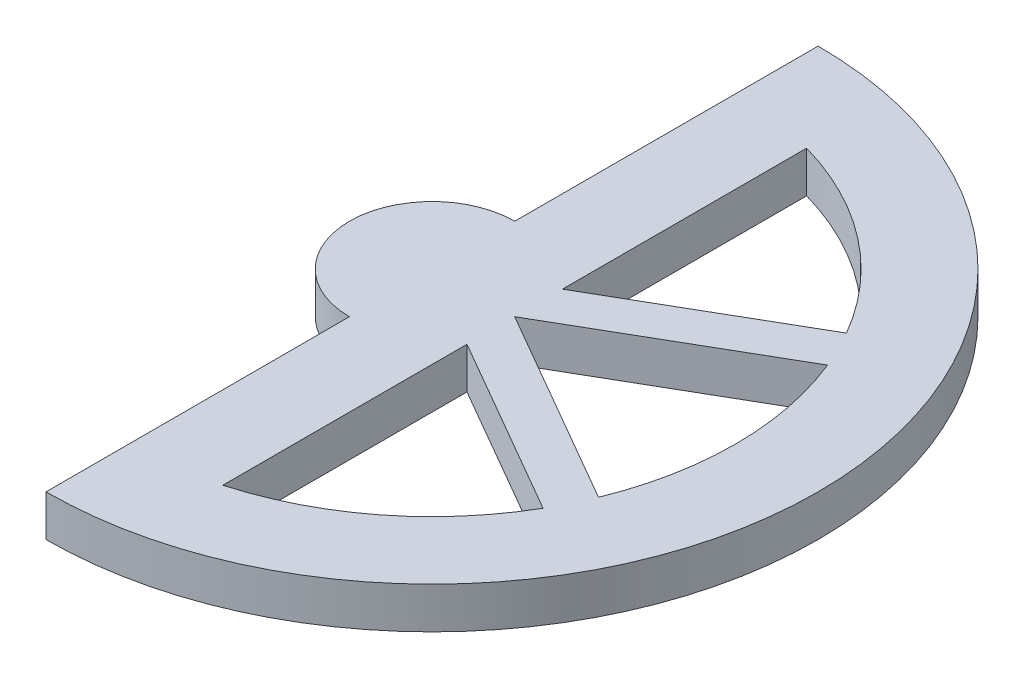
ISO-10303-21;
HEADER;
FILE_DESCRIPTION(('STEP AP214'),'2;1');
FILE_NAME('part.step','',(''),(''),'','','');
FILE_SCHEMA(('AUTOMOTIVE_DESIGN { 1 0 10303 214 1 1 1 1 }'));
ENDSEC;
DATA;
#1=APPLICATION_CONTEXT('core data for automotive mechanical design processes');
#2=APPLICATION_PROTOCOL_DEFINITION('international standard','automotive_design',2000,#1);
#3=PRODUCT_CONTEXT('',#1,'mechanical');
#4=PRODUCT('Part','Part','',(#3));
#5=PRODUCT_RELATED_PRODUCT_CATEGORY('part','',(#4));
#6=PRODUCT_DEFINITION_FORMATION('','',#4);
#7=PRODUCT_DEFINITION_CONTEXT('part definition',#1,'design');
#8=PRODUCT_DEFINITION('design','',#6,#7);
#9=PRODUCT_DEFINITION_SHAPE('','',#8);
#10=(LENGTH_UNIT() NAMED_UNIT(*) SI_UNIT(.MILLI.,.METRE.));
#11=(NAMED_UNIT(*) PLANE_ANGLE_UNIT() SI_UNIT($,.RADIAN.));
#12=(NAMED_UNIT(*) SI_UNIT($,.STERADIAN.) SOLID_ANGLE_UNIT());
#13=UNCERTAINTY_MEASURE_WITH_UNIT(LENGTH_MEASURE(1.E-05),#10,'distance_accuracy_value','');
#14=(GEOMETRIC_REPRESENTATION_CONTEXT(3) GLOBAL_UNCERTAINTY_ASSIGNED_CONTEXT((#13)) GLOBAL_UNIT_ASSIGNED_CONTEXT((#10,
#11,#12)) REPRESENTATION_CONTEXT('',''));
#15=CARTESIAN_POINT('',(0.,0.,0.));
#16=DIRECTION('',(0.,0.,1.));
#17=DIRECTION('',(1.,0.,0.));
#18=AXIS2_PLACEMENT_3D('',#15,#16,#17);
#19=CARTESIAN_POINT('',(0.,3.175,0.));
#20=DIRECTION('',(0.,1.,0.));
#21=DIRECTION('',(0.,0.,1.));
#22=AXIS2_PLACEMENT_3D('',#19,#20,#21);
#23=PLANE('',#22);
#24=CARTESIAN_POINT('',(0.,3.175,0.));
#25=DIRECTION('',(0.,1.,0.));
#26=DIRECTION('',(0.,0.,1.));
#27=AXIS2_PLACEMENT_3D('',#24,#25,#26);
#28=CIRCLE('',#27,29.6545);
#29=CARTESIAN_POINT('',(0.,3.175,29.6545));
#30=VERTEX_POINT('',#29);
#31=CARTESIAN_POINT('',(0.,3.175,-29.6545));
#32=VERTEX_POINT('',#31);
#33=EDGE_CURVE('E203',#30,#32,#28,.T.);
#34=ORIENTED_EDGE('',*,*,#33,.T.);
#35=DIRECTION('',(0.,0.,1.));
#36=VECTOR('',#35,1.);
#37=CARTESIAN_POINT('',(0.,3.175,-29.6545));
#38=LINE('',#37,#36);
#39=CARTESIAN_POINT('',(0.,3.175,-6.35));
#40=VERTEX_POINT('',#39);
#41=EDGE_CURVE('E206',#32,#40,#38,.T.);
#42=ORIENTED_EDGE('',*,*,#41,.T.);
#43=CARTESIAN_POINT('',(0.,3.175,0.));
#44=DIRECTION('',(0.,1.,0.));
#45=DIRECTION('',(0.,0.,1.));
#46=AXIS2_PLACEMENT_3D('',#43,#44,#45);
#47=CIRCLE('',#46,6.35);
#48=CARTESIAN_POINT('',(0.,3.175,6.35));
#49=VERTEX_POINT('',#48);
#50=EDGE_CURVE('E209',#40,#49,#47,.T.);
#51=ORIENTED_EDGE('',*,*,#50,.T.);
#52=DIRECTION('',(0.,0.,1.));
#53=VECTOR('',#52,1.);
#54=CARTESIAN_POINT('',(0.,3.175,6.35));
#55=LINE('',#54,#53);
#56=EDGE_CURVE('E211',#49,#30,#55,.T.);
#57=ORIENTED_EDGE('',*,*,#56,.T.);
#58=EDGE_LOOP('',(#34,#42,#51,#57));
#59=FACE_BOUND('',#58,.T.);
#60=CARTESIAN_POINT('',(0.,3.175,0.));
#61=DIRECTION('',(0.,1.,0.));
#62=DIRECTION('',(0.,0.,1.));
#63=AXIS2_PLACEMENT_3D('',#60,#61,#62);
#64=CIRCLE('',#63,23.3045);
#65=CARTESIAN_POINT('',(6.35000000000001,3.175,22.4226943129054));
#66=VERTEX_POINT('',#65);
#67=CARTESIAN_POINT('',(20.1822890224945,3.175,11.65225));
#68=VERTEX_POINT('',#67);
#69=EDGE_CURVE('E181',#66,#68,#64,.T.);
#70=ORIENTED_EDGE('',*,*,#69,.F.);
#71=DIRECTION('',(0.,0.,1.));
#72=VECTOR('',#71,1.);
#73=CARTESIAN_POINT('',(6.35000000000001,3.175,3.66617420935412));
#74=LINE('',#73,#72);
#75=CARTESIAN_POINT('',(6.35000000000001,3.175,3.66617420935412));
#76=VERTEX_POINT('',#75);
#77=EDGE_CURVE('E179',#76,#66,#74,.T.);
#78=ORIENTED_EDGE('',*,*,#77,.F.);
#79=DIRECTION('',(-0.86602540378444,0.,-0.499999999999998));
#80=VECTOR('',#79,1.);
#81=CARTESIAN_POINT('',(6.35000000000001,3.175,3.66617420935412));
#82=LINE('',#81,#80);
#83=EDGE_CURVE('E185',#68,#76,#82,.T.);
#84=ORIENTED_EDGE('',*,*,#83,.F.);
#85=EDGE_LOOP('',(#70,#78,#84));
#86=FACE_BOUND('',#85,.T.);
#87=DIRECTION('',(0.,0.,1.));
#88=VECTOR('',#87,1.);
#89=CARTESIAN_POINT('',(6.35000000000001,3.175,-22.4226943129054));
#90=LINE('',#89,#88);
#91=CARTESIAN_POINT('',(6.35000000000001,3.175,-22.4226943129054));
#92=VERTEX_POINT('',#91);
#93=CARTESIAN_POINT('',(6.35,3.175,-3.6661742093542));
#94=VERTEX_POINT('',#93);
#95=EDGE_CURVE('E157',#92,#94,#90,.T.);
#96=ORIENTED_EDGE('',*,*,#95,.F.);
#97=CARTESIAN_POINT('',(0.,3.175,0.));
#98=DIRECTION('',(0.,1.,0.));
#99=DIRECTION('',(0.,0.,1.));
#100=AXIS2_PLACEMENT_3D('',#97,#98,#99);
#101=CIRCLE('',#100,23.3045);
#102=CARTESIAN_POINT('',(20.1822890224944,3.175,-11.6522500000001));
#103=VERTEX_POINT('',#102);
#104=EDGE_CURVE('E155',#103,#92,#101,.T.);
#105=ORIENTED_EDGE('',*,*,#104,.F.);
#106=DIRECTION('',(0.866025403784436,0.,-0.500000000000005));
#107=VECTOR('',#106,1.);
#108=CARTESIAN_POINT('',(6.35,3.175,-3.6661742093542));
#109=LINE('',#108,#107);
#110=EDGE_CURVE('E161',#94,#103,#109,.T.);
#111=ORIENTED_EDGE('',*,*,#110,.F.);
#112=EDGE_LOOP('',(#96,#105,#111));
#113=FACE_BOUND('',#112,.T.);
#114=DIRECTION('',(0.86602540378444,0.,0.499999999999998));
#115=VECTOR('',#114,1.);
#116=CARTESIAN_POINT('',(6.34999999999995,3.175,0.));
#117=LINE('',#116,#115);
#118=CARTESIAN_POINT('',(6.34999999999995,3.175,0.));
#119=VERTEX_POINT('',#118);
#120=CARTESIAN_POINT('',(21.5816071678007,3.175,8.79397249852033));
#121=VERTEX_POINT('',#120);
#122=EDGE_CURVE('E136',#119,#121,#117,.T.);
#123=ORIENTED_EDGE('',*,*,#122,.F.);
#124=DIRECTION('',(-0.866025403784436,0.,0.500000000000005));
#125=VECTOR('',#124,1.);
#126=CARTESIAN_POINT('',(6.34999999999995,3.175,0.));
#127=LINE('',#126,#125);
#128=CARTESIAN_POINT('',(21.5816071678007,3.175,-8.79397249852051));
#129=VERTEX_POINT('',#128);
#130=EDGE_CURVE('E128',#129,#119,#127,.T.);
#131=ORIENTED_EDGE('',*,*,#130,.F.);
#132=CARTESIAN_POINT('',(0.,3.175,0.));
#133=DIRECTION('',(0.,1.,0.));
#134=DIRECTION('',(0.,0.,1.));
#135=AXIS2_PLACEMENT_3D('',#132,#133,#134);
#136=CIRCLE('',#135,23.3045);
#137=EDGE_CURVE('E145',#121,#129,#136,.T.);
#138=ORIENTED_EDGE('',*,*,#137,.F.);
#139=EDGE_LOOP('',(#123,#131,#138));
#140=FACE_BOUND('',#139,.T.);
#141=ADVANCED_FACE('F33',(#59,#86,#113,#140),#23,.T.);
#142=CARTESIAN_POINT('',(0.,0.,0.));
#143=DIRECTION('',(0.,1.,0.));
#144=DIRECTION('',(0.,0.,1.));
#145=AXIS2_PLACEMENT_3D('',#142,#143,#144);
#146=PLANE('',#145);
#147=CARTESIAN_POINT('',(0.,0.,0.));
#148=DIRECTION('',(0.,1.,0.));
#149=DIRECTION('',(0.,0.,1.));
#150=AXIS2_PLACEMENT_3D('',#147,#148,#149);
#151=CIRCLE('',#150,23.3045);
#152=CARTESIAN_POINT('',(20.1822890224944,0.,-11.6522500000001));
#153=VERTEX_POINT('',#152);
#154=CARTESIAN_POINT('',(6.35000000000001,0.,-22.4226943129054));
#155=VERTEX_POINT('',#154);
#156=EDGE_CURVE('E143',#153,#155,#151,.T.);
#157=ORIENTED_EDGE('',*,*,#156,.T.);
#158=DIRECTION('',(0.,0.,1.));
#159=VECTOR('',#158,1.);
#160=CARTESIAN_POINT('',(6.35000000000001,0.,-22.4226943129054));
#161=LINE('',#160,#159);
#162=CARTESIAN_POINT('',(6.35,0.,-3.6661742093542));
#163=VERTEX_POINT('',#162);
#164=EDGE_CURVE('E166',#155,#163,#161,.T.);
#165=ORIENTED_EDGE('',*,*,#164,.T.);
#166=DIRECTION('',(0.866025403784436,0.,-0.500000000000005));
#167=VECTOR('',#166,1.);
#168=CARTESIAN_POINT('',(6.35,0.,-3.6661742093542));
#169=LINE('',#168,#167);
#170=EDGE_CURVE('E158',#163,#153,#169,.T.);
#171=ORIENTED_EDGE('',*,*,#170,.T.);
#172=EDGE_LOOP('',(#157,#165,#171));
#173=FACE_BOUND('',#172,.T.);
#174=CARTESIAN_POINT('',(0.,0.,0.));
#175=DIRECTION('',(0.,1.,0.));
#176=DIRECTION('',(0.,0.,1.));
#177=AXIS2_PLACEMENT_3D('',#174,#175,#176);
#178=CIRCLE('',#177,29.6545);
#179=CARTESIAN_POINT('',(0.,0.,29.6545));
#180=VERTEX_POINT('',#179);
#181=CARTESIAN_POINT('',(0.,0.,-29.6545));
#182=VERTEX_POINT('',#181);
#183=EDGE_CURVE('E202',#180,#182,#178,.T.);
#184=ORIENTED_EDGE('',*,*,#183,.F.);
#185=DIRECTION('',(0.,0.,1.));
#186=VECTOR('',#185,1.);
#187=CARTESIAN_POINT('',(0.,0.,6.35));
#188=LINE('',#187,#186);
#189=CARTESIAN_POINT('',(0.,0.,6.35));
#190=VERTEX_POINT('',#189);
#191=EDGE_CURVE('E207',#190,#180,#188,.T.);
#192=ORIENTED_EDGE('',*,*,#191,.F.);
#193=CARTESIAN_POINT('',(0.,0.,0.));
#194=DIRECTION('',(0.,1.,0.));
#195=DIRECTION('',(0.,0.,1.));
#196=AXIS2_PLACEMENT_3D('',#193,#194,#195);
#197=CIRCLE('',#196,6.35);
#198=CARTESIAN_POINT('',(0.,0.,-6.35));
#199=VERTEX_POINT('',#198);
#200=EDGE_CURVE('E218',#199,#190,#197,.T.);
#201=ORIENTED_EDGE('',*,*,#200,.F.);
#202=DIRECTION('',(0.,0.,1.));
#203=VECTOR('',#202,1.);
#204=CARTESIAN_POINT('',(0.,0.,-29.6545));
#205=LINE('',#204,#203);
#206=EDGE_CURVE('E216',#182,#199,#205,.T.);
#207=ORIENTED_EDGE('',*,*,#206,.F.);
#208=EDGE_LOOP('',(#184,#192,#201,#207));
#209=FACE_BOUND('',#208,.T.);
#210=DIRECTION('',(0.,0.,1.));
#211=VECTOR('',#210,1.);
#212=CARTESIAN_POINT('',(6.35000000000001,0.,3.66617420935412));
#213=LINE('',#212,#211);
#214=CARTESIAN_POINT('',(6.35000000000001,0.,3.66617420935412));
#215=VERTEX_POINT('',#214);
#216=CARTESIAN_POINT('',(6.35000000000001,0.,22.4226943129054));
#217=VERTEX_POINT('',#216);
#218=EDGE_CURVE('E178',#215,#217,#213,.T.);
#219=ORIENTED_EDGE('',*,*,#218,.T.);
#220=CARTESIAN_POINT('',(0.,0.,0.));
#221=DIRECTION('',(0.,1.,0.));
#222=DIRECTION('',(0.,0.,1.));
#223=AXIS2_PLACEMENT_3D('',#220,#221,#222);
#224=CIRCLE('',#223,23.3045);
#225=CARTESIAN_POINT('',(20.1822890224945,0.,11.65225));
#226=VERTEX_POINT('',#225);
#227=EDGE_CURVE('E190',#217,#226,#224,.T.);
#228=ORIENTED_EDGE('',*,*,#227,.T.);
#229=DIRECTION('',(-0.86602540378444,0.,-0.499999999999998));
#230=VECTOR('',#229,1.);
#231=CARTESIAN_POINT('',(6.35000000000001,0.,3.66617420935412));
#232=LINE('',#231,#230);
#233=EDGE_CURVE('E182',#226,#215,#232,.T.);
#234=ORIENTED_EDGE('',*,*,#233,.T.);
#235=EDGE_LOOP('',(#219,#228,#234));
#236=FACE_BOUND('',#235,.T.);
#237=DIRECTION('',(-0.866025403784436,0.,0.500000000000005));
#238=VECTOR('',#237,1.);
#239=CARTESIAN_POINT('',(6.34999999999995,0.,0.));
#240=LINE('',#239,#238);
#241=CARTESIAN_POINT('',(21.5816071678007,0.,-8.79397249852051));
#242=VERTEX_POINT('',#241);
#243=CARTESIAN_POINT('',(6.34999999999995,0.,0.));
#244=VERTEX_POINT('',#243);
#245=EDGE_CURVE('E56',#242,#244,#240,.T.);
#246=ORIENTED_EDGE('',*,*,#245,.T.);
#247=DIRECTION('',(0.86602540378444,0.,0.499999999999998));
#248=VECTOR('',#247,1.);
#249=CARTESIAN_POINT('',(6.34999999999995,0.,0.));
#250=LINE('',#249,#248);
#251=CARTESIAN_POINT('',(21.5816071678007,0.,8.79397249852033));
#252=VERTEX_POINT('',#251);
#253=EDGE_CURVE('E142',#244,#252,#250,.T.);
#254=ORIENTED_EDGE('',*,*,#253,.T.);
#255=CARTESIAN_POINT('',(0.,0.,0.));
#256=DIRECTION('',(0.,1.,0.));
#257=DIRECTION('',(0.,0.,1.));
#258=AXIS2_PLACEMENT_3D('',#255,#256,#257);
#259=CIRCLE('',#258,23.3045);
#260=EDGE_CURVE('E137',#252,#242,#259,.T.);
#261=ORIENTED_EDGE('',*,*,#260,.T.);
#262=EDGE_LOOP('',(#246,#254,#261));
#263=FACE_BOUND('',#262,.T.);
#264=ADVANCED_FACE('F236',(#173,#209,#236,#263),#146,.F.);
#265=CARTESIAN_POINT('',(0.,3.175,0.));
#266=DIRECTION('',(0.,-1.,0.));
#267=DIRECTION('',(0.,0.,-1.));
#268=AXIS2_PLACEMENT_3D('',#265,#266,#267);
#269=CYLINDRICAL_SURFACE('',#268,29.6545);
#270=ORIENTED_EDGE('',*,*,#183,.T.);
#271=DIRECTION('',(0.,-1.,0.));
#272=VECTOR('',#271,1.);
#273=CARTESIAN_POINT('',(0.,3.175,-29.6545));
#274=LINE('',#273,#272);
#275=EDGE_CURVE('E11',#32,#182,#274,.T.);
#276=ORIENTED_EDGE('',*,*,#275,.F.);
#277=ORIENTED_EDGE('',*,*,#33,.F.);
#278=DIRECTION('',(0.,-1.,0.));
#279=VECTOR('',#278,1.);
#280=CARTESIAN_POINT('',(0.,3.175,29.6545));
#281=LINE('',#280,#279);
#282=EDGE_CURVE('E213',#30,#180,#281,.T.);
#283=ORIENTED_EDGE('',*,*,#282,.T.);
#284=EDGE_LOOP('',(#270,#276,#277,#283));
#285=FACE_BOUND('',#284,.T.);
#286=ADVANCED_FACE('F35',(#285),#269,.T.);
#287=CARTESIAN_POINT('',(0.,3.175,-29.6545));
#288=DIRECTION('',(1.,0.,0.));
#289=DIRECTION('',(0.,0.,-1.));
#290=AXIS2_PLACEMENT_3D('',#287,#288,#289);
#291=PLANE('',#290);
#292=ORIENTED_EDGE('',*,*,#206,.T.);
#293=DIRECTION('',(0.,-1.,0.));
#294=VECTOR('',#293,1.);
#295=CARTESIAN_POINT('',(0.,3.175,-6.35));
#296=LINE('',#295,#294);
#297=EDGE_CURVE('E41',#40,#199,#296,.T.);
#298=ORIENTED_EDGE('',*,*,#297,.F.);
#299=ORIENTED_EDGE('',*,*,#41,.F.);
#300=ORIENTED_EDGE('',*,*,#275,.T.);
#301=EDGE_LOOP('',(#292,#298,#299,#300));
#302=FACE_BOUND('',#301,.T.);
#303=ADVANCED_FACE('F247',(#302),#291,.F.);
#304=CARTESIAN_POINT('',(0.,3.175,0.));
#305=DIRECTION('',(0.,-1.,0.));
#306=DIRECTION('',(0.,0.,-1.));
#307=AXIS2_PLACEMENT_3D('',#304,#305,#306);
#308=CYLINDRICAL_SURFACE('',#307,6.35);
#309=ORIENTED_EDGE('',*,*,#200,.T.);
#310=DIRECTION('',(0.,-1.,0.));
#311=VECTOR('',#310,1.);
#312=CARTESIAN_POINT('',(0.,3.175,6.35));
#313=LINE('',#312,#311);
#314=EDGE_CURVE('E223',#49,#190,#313,.T.);
#315=ORIENTED_EDGE('',*,*,#314,.F.);
#316=ORIENTED_EDGE('',*,*,#50,.F.);
#317=ORIENTED_EDGE('',*,*,#297,.T.);
#318=EDGE_LOOP('',(#309,#315,#316,#317));
#319=FACE_BOUND('',#318,.T.);
#320=ADVANCED_FACE('F230',(#319),#308,.T.);
#321=CARTESIAN_POINT('',(0.,3.175,6.35));
#322=DIRECTION('',(1.,0.,0.));
#323=DIRECTION('',(0.,0.,-1.));
#324=AXIS2_PLACEMENT_3D('',#321,#322,#323);
#325=PLANE('',#324);
#326=ORIENTED_EDGE('',*,*,#191,.T.);
#327=ORIENTED_EDGE('',*,*,#282,.F.);
#328=ORIENTED_EDGE('',*,*,#56,.F.);
#329=ORIENTED_EDGE('',*,*,#314,.T.);
#330=EDGE_LOOP('',(#326,#327,#328,#329));
#331=FACE_BOUND('',#330,.T.);
#332=ADVANCED_FACE('F240',(#331),#325,.F.);
#333=CARTESIAN_POINT('',(6.35000000000001,3.175,3.66617420935412));
#334=DIRECTION('',(1.,0.,0.));
#335=DIRECTION('',(0.,0.,-1.));
#336=AXIS2_PLACEMENT_3D('',#333,#334,#335);
#337=PLANE('',#336);
#338=ORIENTED_EDGE('',*,*,#218,.F.);
#339=DIRECTION('',(0.,-1.,0.));
#340=VECTOR('',#339,1.);
#341=CARTESIAN_POINT('',(6.35000000000001,3.175,3.66617420935412));
#342=LINE('',#341,#340);
#343=EDGE_CURVE('E187',#76,#215,#342,.T.);
#344=ORIENTED_EDGE('',*,*,#343,.F.);
#345=ORIENTED_EDGE('',*,*,#77,.T.);
#346=DIRECTION('',(0.,-1.,0.));
#347=VECTOR('',#346,1.);
#348=CARTESIAN_POINT('',(6.35000000000001,3.175,22.4226943129054));
#349=LINE('',#348,#347);
#350=EDGE_CURVE('E199',#66,#217,#349,.T.);
#351=ORIENTED_EDGE('',*,*,#350,.T.);
#352=EDGE_LOOP('',(#338,#344,#345,#351));
#353=FACE_BOUND('',#352,.T.);
#354=ADVANCED_FACE('F262',(#353),#337,.T.);
#355=CARTESIAN_POINT('',(0.,3.175,0.));
#356=DIRECTION('',(0.,-1.,0.));
#357=DIRECTION('',(0.,0.,-1.));
#358=AXIS2_PLACEMENT_3D('',#355,#356,#357);
#359=CYLINDRICAL_SURFACE('',#358,23.3045);
#360=ORIENTED_EDGE('',*,*,#227,.F.);
#361=ORIENTED_EDGE('',*,*,#350,.F.);
#362=ORIENTED_EDGE('',*,*,#69,.T.);
#363=DIRECTION('',(0.,-1.,0.));
#364=VECTOR('',#363,1.);
#365=CARTESIAN_POINT('',(20.1822890224945,3.175,11.65225));
#366=LINE('',#365,#364);
#367=EDGE_CURVE('E197',#68,#226,#366,.T.);
#368=ORIENTED_EDGE('',*,*,#367,.T.);
#369=EDGE_LOOP('',(#360,#361,#362,#368));
#370=FACE_BOUND('',#369,.T.);
#371=ADVANCED_FACE('F269',(#370),#359,.F.);
#372=CARTESIAN_POINT('',(6.35000000000001,3.175,3.66617420935412));
#373=DIRECTION('',(-0.499999999999998,0.,0.86602540378444));
#374=DIRECTION('',(0.86602540378444,0.,0.499999999999998));
#375=AXIS2_PLACEMENT_3D('',#372,#373,#374);
#376=PLANE('',#375);
#377=ORIENTED_EDGE('',*,*,#233,.F.);
#378=ORIENTED_EDGE('',*,*,#367,.F.);
#379=ORIENTED_EDGE('',*,*,#83,.T.);
#380=ORIENTED_EDGE('',*,*,#343,.T.);
#381=EDGE_LOOP('',(#377,#378,#379,#380));
#382=FACE_BOUND('',#381,.T.);
#383=ADVANCED_FACE('F274',(#382),#376,.T.);
#384=CARTESIAN_POINT('',(0.,3.175,0.));
#385=DIRECTION('',(0.,-1.,0.));
#386=DIRECTION('',(0.,0.,-1.));
#387=AXIS2_PLACEMENT_3D('',#384,#385,#386);
#388=CYLINDRICAL_SURFACE('',#387,23.3045);
#389=ORIENTED_EDGE('',*,*,#156,.F.);
#390=DIRECTION('',(0.,-1.,0.));
#391=VECTOR('',#390,1.);
#392=CARTESIAN_POINT('',(20.1822890224944,3.175,-11.6522500000001));
#393=LINE('',#392,#391);
#394=EDGE_CURVE('E163',#103,#153,#393,.T.);
#395=ORIENTED_EDGE('',*,*,#394,.F.);
#396=ORIENTED_EDGE('',*,*,#104,.T.);
#397=DIRECTION('',(0.,-1.,0.));
#398=VECTOR('',#397,1.);
#399=CARTESIAN_POINT('',(6.35000000000001,3.175,-22.4226943129054));
#400=LINE('',#399,#398);
#401=EDGE_CURVE('E175',#92,#155,#400,.T.);
#402=ORIENTED_EDGE('',*,*,#401,.T.);
#403=EDGE_LOOP('',(#389,#395,#396,#402));
#404=FACE_BOUND('',#403,.T.);
#405=ADVANCED_FACE('F293',(#404),#388,.F.);
#406=CARTESIAN_POINT('',(6.35000000000001,3.175,-22.4226943129054));
#407=DIRECTION('',(1.,0.,0.));
#408=DIRECTION('',(0.,0.,-1.));
#409=AXIS2_PLACEMENT_3D('',#406,#407,#408);
#410=PLANE('',#409);
#411=ORIENTED_EDGE('',*,*,#164,.F.);
#412=ORIENTED_EDGE('',*,*,#401,.F.);
#413=ORIENTED_EDGE('',*,*,#95,.T.);
#414=DIRECTION('',(0.,-1.,0.));
#415=VECTOR('',#414,1.);
#416=CARTESIAN_POINT('',(6.35,3.175,-3.6661742093542));
#417=LINE('',#416,#415);
#418=EDGE_CURVE('E173',#94,#163,#417,.T.);
#419=ORIENTED_EDGE('',*,*,#418,.T.);
#420=EDGE_LOOP('',(#411,#412,#413,#419));
#421=FACE_BOUND('',#420,.T.);
#422=ADVANCED_FACE('F290',(#421),#410,.T.);
#423=CARTESIAN_POINT('',(6.35,3.175,-3.6661742093542));
#424=DIRECTION('',(-0.500000000000005,0.,-0.866025403784436));
#425=DIRECTION('',(-0.866025403784436,0.,0.500000000000005));
#426=AXIS2_PLACEMENT_3D('',#423,#424,#425);
#427=PLANE('',#426);
#428=ORIENTED_EDGE('',*,*,#170,.F.);
#429=ORIENTED_EDGE('',*,*,#418,.F.);
#430=ORIENTED_EDGE('',*,*,#110,.T.);
#431=ORIENTED_EDGE('',*,*,#394,.T.);
#432=EDGE_LOOP('',(#428,#429,#430,#431));
#433=FACE_BOUND('',#432,.T.);
#434=ADVANCED_FACE('F296',(#433),#427,.T.);
#435=CARTESIAN_POINT('',(6.34999999999995,3.175,0.));
#436=DIRECTION('',(0.500000000000005,0.,0.866025403784436));
#437=DIRECTION('',(0.866025403784436,0.,-0.500000000000005));
#438=AXIS2_PLACEMENT_3D('',#435,#436,#437);
#439=PLANE('',#438);
#440=ORIENTED_EDGE('',*,*,#245,.F.);
#441=DIRECTION('',(0.,-1.,0.));
#442=VECTOR('',#441,1.);
#443=CARTESIAN_POINT('',(21.5816071678007,3.175,-8.79397249852051));
#444=LINE('',#443,#442);
#445=EDGE_CURVE('E132',#129,#242,#444,.T.);
#446=ORIENTED_EDGE('',*,*,#445,.F.);
#447=ORIENTED_EDGE('',*,*,#130,.T.);
#448=DIRECTION('',(0.,-1.,0.));
#449=VECTOR('',#448,1.);
#450=CARTESIAN_POINT('',(6.34999999999995,3.175,0.));
#451=LINE('',#450,#449);
#452=EDGE_CURVE('E131',#119,#244,#451,.T.);
#453=ORIENTED_EDGE('',*,*,#452,.T.);
#454=EDGE_LOOP('',(#440,#446,#447,#453));
#455=FACE_BOUND('',#454,.T.);
#456=ADVANCED_FACE('F130',(#455),#439,.T.);
#457=CARTESIAN_POINT('',(6.34999999999995,3.175,0.));
#458=DIRECTION('',(0.499999999999998,0.,-0.86602540378444));
#459=DIRECTION('',(-0.86602540378444,0.,-0.499999999999998));
#460=AXIS2_PLACEMENT_3D('',#457,#458,#459);
#461=PLANE('',#460);
#462=ORIENTED_EDGE('',*,*,#253,.F.);
#463=ORIENTED_EDGE('',*,*,#452,.F.);
#464=ORIENTED_EDGE('',*,*,#122,.T.);
#465=DIRECTION('',(0.,-1.,0.));
#466=VECTOR('',#465,1.);
#467=CARTESIAN_POINT('',(21.5816071678007,3.175,8.79397249852033));
#468=LINE('',#467,#466);
#469=EDGE_CURVE('E48',#121,#252,#468,.T.);
#470=ORIENTED_EDGE('',*,*,#469,.T.);
#471=EDGE_LOOP('',(#462,#463,#464,#470));
#472=FACE_BOUND('',#471,.T.);
#473=ADVANCED_FACE('F140',(#472),#461,.T.);
#474=CARTESIAN_POINT('',(0.,3.175,0.));
#475=DIRECTION('',(0.,-1.,0.));
#476=DIRECTION('',(0.,0.,-1.));
#477=AXIS2_PLACEMENT_3D('',#474,#475,#476);
#478=CYLINDRICAL_SURFACE('',#477,23.3045);
#479=ORIENTED_EDGE('',*,*,#260,.F.);
#480=ORIENTED_EDGE('',*,*,#469,.F.);
#481=ORIENTED_EDGE('',*,*,#137,.T.);
#482=ORIENTED_EDGE('',*,*,#445,.T.);
#483=EDGE_LOOP('',(#479,#480,#481,#482));
#484=FACE_BOUND('',#483,.T.);
#485=ADVANCED_FACE('F341',(#484),#478,.F.);
#486=CLOSED_SHELL('',(#141,#264,#286,#303,#320,#332,#354,#371,#383,#405,#422,#434,#456,#473,#485));
#487=MANIFOLD_SOLID_BREP('B2',#486);
#488=ADVANCED_BREP_SHAPE_REPRESENTATION('',(#18,#487),#14);
#489=SHAPE_DEFINITION_REPRESENTATION(#9,#488);
ENDSEC;
END-ISO-10303-21;
